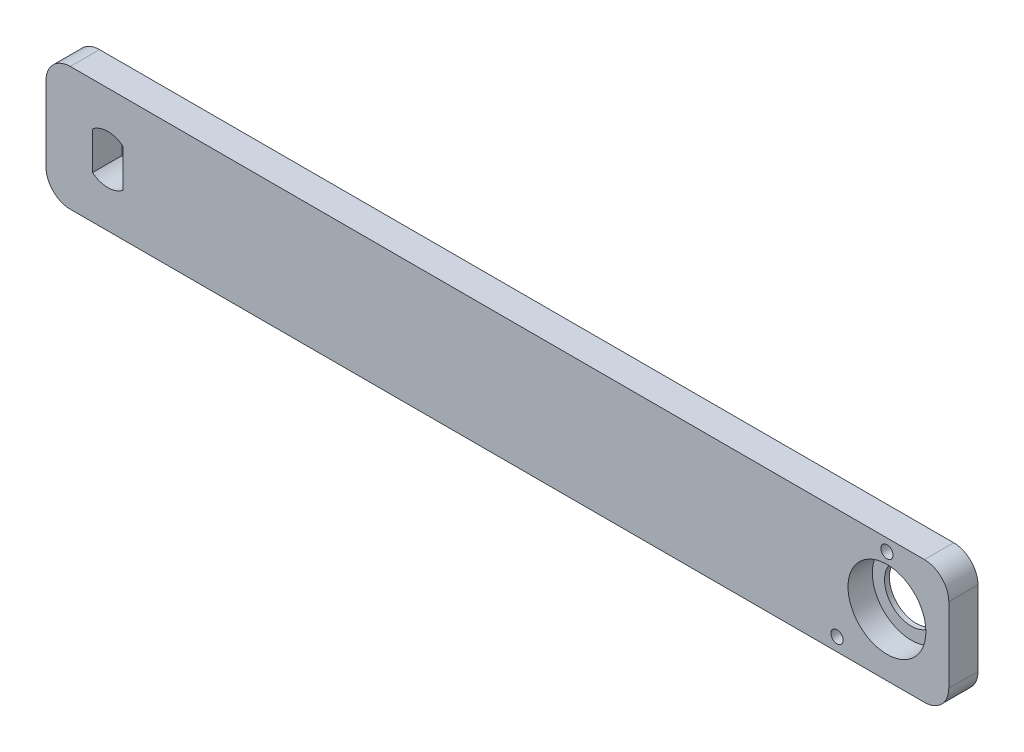
ISO-10303-21;
HEADER;
FILE_DESCRIPTION(('STEP AP214'),'2;1');
FILE_NAME('part.step','',(''),(''),'','','');
FILE_SCHEMA(('AUTOMOTIVE_DESIGN { 1 0 10303 214 1 1 1 1 }'));
ENDSEC;
DATA;
#1=APPLICATION_CONTEXT('core data for automotive mechanical design processes');
#2=APPLICATION_PROTOCOL_DEFINITION('international standard','automotive_design',2000,#1);
#3=PRODUCT_CONTEXT('',#1,'mechanical');
#4=PRODUCT('Part','Part','',(#3));
#5=PRODUCT_RELATED_PRODUCT_CATEGORY('part','',(#4));
#6=PRODUCT_DEFINITION_FORMATION('','',#4);
#7=PRODUCT_DEFINITION_CONTEXT('part definition',#1,'design');
#8=PRODUCT_DEFINITION('design','',#6,#7);
#9=PRODUCT_DEFINITION_SHAPE('','',#8);
#10=(LENGTH_UNIT() NAMED_UNIT(*) SI_UNIT(.MILLI.,.METRE.));
#11=(NAMED_UNIT(*) PLANE_ANGLE_UNIT() SI_UNIT($,.RADIAN.));
#12=(NAMED_UNIT(*) SI_UNIT($,.STERADIAN.) SOLID_ANGLE_UNIT());
#13=UNCERTAINTY_MEASURE_WITH_UNIT(LENGTH_MEASURE(1.E-05),#10,'distance_accuracy_value','');
#14=(GEOMETRIC_REPRESENTATION_CONTEXT(3) GLOBAL_UNCERTAINTY_ASSIGNED_CONTEXT((#13)) GLOBAL_UNIT_ASSIGNED_CONTEXT((#10,
#11,#12)) REPRESENTATION_CONTEXT('',''));
#15=CARTESIAN_POINT('',(0.,0.,0.));
#16=DIRECTION('',(0.,0.,1.));
#17=DIRECTION('',(1.,0.,0.));
#18=AXIS2_PLACEMENT_3D('',#15,#16,#17);
#19=CARTESIAN_POINT('',(320.,0.,12.));
#20=DIRECTION('',(0.,0.,-1.));
#21=DIRECTION('',(-1.,0.,0.));
#22=AXIS2_PLACEMENT_3D('',#19,#20,#21);
#23=CYLINDRICAL_SURFACE('',#22,11.);
#24=CARTESIAN_POINT('',(320.,0.,0.));
#25=DIRECTION('',(0.,0.,1.));
#26=DIRECTION('',(1.,0.,0.));
#27=AXIS2_PLACEMENT_3D('',#24,#25,#26);
#28=CIRCLE('',#27,11.);
#29=CARTESIAN_POINT('',(331.,0.,0.));
#30=VERTEX_POINT('',#29);
#31=EDGE_CURVE('E147',#30,#30,#28,.T.);
#32=ORIENTED_EDGE('',*,*,#31,.F.);
#33=EDGE_LOOP('',(#32));
#34=FACE_BOUND('',#33,.T.);
#35=CARTESIAN_POINT('',(320.,0.,2.));
#36=DIRECTION('',(0.,0.,1.));
#37=DIRECTION('',(1.,0.,0.));
#38=AXIS2_PLACEMENT_3D('',#35,#36,#37);
#39=CIRCLE('',#38,11.);
#40=CARTESIAN_POINT('',(331.,0.,2.));
#41=VERTEX_POINT('',#40);
#42=EDGE_CURVE('E41',#41,#41,#39,.T.);
#43=ORIENTED_EDGE('',*,*,#42,.T.);
#44=EDGE_LOOP('',(#43));
#45=FACE_BOUND('',#44,.T.);
#46=ADVANCED_FACE('F37',(#34,#45),#23,.F.);
#47=CARTESIAN_POINT('',(0.,0.,12.));
#48=DIRECTION('',(0.,0.,1.));
#49=DIRECTION('',(1.,0.,0.));
#50=AXIS2_PLACEMENT_3D('',#47,#48,#49);
#51=PLANE('',#50);
#52=CARTESIAN_POINT('',(299.5,-20.0000000000004,12.));
#53=DIRECTION('',(0.,0.,1.));
#54=DIRECTION('',(1.,0.,0.));
#55=AXIS2_PLACEMENT_3D('',#52,#53,#54);
#56=CIRCLE('',#55,2.50000000000002);
#57=CARTESIAN_POINT('',(302.,-20.0000000000004,12.));
#58=VERTEX_POINT('',#57);
#59=EDGE_CURVE('E434',#58,#58,#56,.T.);
#60=ORIENTED_EDGE('',*,*,#59,.F.);
#61=EDGE_LOOP('',(#60));
#62=FACE_BOUND('',#61,.T.);
#63=CARTESIAN_POINT('',(320.,20.5,12.));
#64=DIRECTION('',(0.,0.,1.));
#65=DIRECTION('',(1.,0.,0.));
#66=AXIS2_PLACEMENT_3D('',#63,#64,#65);
#67=CIRCLE('',#66,2.50000000000002);
#68=CARTESIAN_POINT('',(322.5,20.5,12.));
#69=VERTEX_POINT('',#68);
#70=EDGE_CURVE('E436',#69,#69,#67,.T.);
#71=ORIENTED_EDGE('',*,*,#70,.F.);
#72=EDGE_LOOP('',(#71));
#73=FACE_BOUND('',#72,.T.);
#74=CARTESIAN_POINT('',(320.,0.,12.));
#75=DIRECTION('',(0.,0.,1.));
#76=DIRECTION('',(1.,0.,0.));
#77=AXIS2_PLACEMENT_3D('',#74,#75,#76);
#78=CIRCLE('',#77,16.);
#79=CARTESIAN_POINT('',(336.,0.,12.));
#80=VERTEX_POINT('',#79);
#81=EDGE_CURVE('E442',#80,#80,#78,.T.);
#82=ORIENTED_EDGE('',*,*,#81,.F.);
#83=EDGE_LOOP('',(#82));
#84=FACE_BOUND('',#83,.T.);
#85=DIRECTION('',(1.,0.,0.));
#86=VECTOR('',#85,1.);
#87=CARTESIAN_POINT('',(-25.4,-25.4,12.));
#88=LINE('',#87,#86);
#89=CARTESIAN_POINT('',(-15.4,-25.4,12.));
#90=VERTEX_POINT('',#89);
#91=CARTESIAN_POINT('',(335.4,-25.4,12.));
#92=VERTEX_POINT('',#91);
#93=EDGE_CURVE('E178',#90,#92,#88,.T.);
#94=ORIENTED_EDGE('',*,*,#93,.T.);
#95=CARTESIAN_POINT('',(335.4,-15.4,12.));
#96=DIRECTION('',(0.,0.,1.));
#97=DIRECTION('',(1.,0.,0.));
#98=AXIS2_PLACEMENT_3D('',#95,#96,#97);
#99=CIRCLE('',#98,10.);
#100=CARTESIAN_POINT('',(345.4,-15.4,12.));
#101=VERTEX_POINT('',#100);
#102=EDGE_CURVE('E218',#92,#101,#99,.T.);
#103=ORIENTED_EDGE('',*,*,#102,.T.);
#104=DIRECTION('',(0.,1.,0.));
#105=VECTOR('',#104,1.);
#106=CARTESIAN_POINT('',(345.4,25.4,12.));
#107=LINE('',#106,#105);
#108=CARTESIAN_POINT('',(345.4,15.4,12.));
#109=VERTEX_POINT('',#108);
#110=EDGE_CURVE('E182',#101,#109,#107,.T.);
#111=ORIENTED_EDGE('',*,*,#110,.T.);
#112=CARTESIAN_POINT('',(335.4,15.4,12.));
#113=DIRECTION('',(0.,0.,1.));
#114=DIRECTION('',(1.,0.,0.));
#115=AXIS2_PLACEMENT_3D('',#112,#113,#114);
#116=CIRCLE('',#115,10.);
#117=CARTESIAN_POINT('',(335.4,25.4,12.));
#118=VERTEX_POINT('',#117);
#119=EDGE_CURVE('E60',#109,#118,#116,.T.);
#120=ORIENTED_EDGE('',*,*,#119,.T.);
#121=DIRECTION('',(-1.,0.,0.));
#122=VECTOR('',#121,1.);
#123=CARTESIAN_POINT('',(-25.4,25.4,12.));
#124=LINE('',#123,#122);
#125=CARTESIAN_POINT('',(-15.4,25.4,12.));
#126=VERTEX_POINT('',#125);
#127=EDGE_CURVE('E184',#118,#126,#124,.T.);
#128=ORIENTED_EDGE('',*,*,#127,.T.);
#129=CARTESIAN_POINT('',(-15.4,15.4,12.));
#130=DIRECTION('',(0.,0.,1.));
#131=DIRECTION('',(1.,0.,0.));
#132=AXIS2_PLACEMENT_3D('',#129,#130,#131);
#133=CIRCLE('',#132,10.);
#134=CARTESIAN_POINT('',(-25.4,15.4,12.));
#135=VERTEX_POINT('',#134);
#136=EDGE_CURVE('E213',#126,#135,#133,.T.);
#137=ORIENTED_EDGE('',*,*,#136,.T.);
#138=DIRECTION('',(0.,-1.,0.));
#139=VECTOR('',#138,1.);
#140=CARTESIAN_POINT('',(-25.4,25.4,12.));
#141=LINE('',#140,#139);
#142=CARTESIAN_POINT('',(-25.4,-15.4,12.));
#143=VERTEX_POINT('',#142);
#144=EDGE_CURVE('E175',#135,#143,#141,.T.);
#145=ORIENTED_EDGE('',*,*,#144,.T.);
#146=CARTESIAN_POINT('',(-15.4,-15.4,12.));
#147=DIRECTION('',(0.,0.,1.));
#148=DIRECTION('',(1.,0.,0.));
#149=AXIS2_PLACEMENT_3D('',#146,#147,#148);
#150=CIRCLE('',#149,10.);
#151=EDGE_CURVE('E215',#143,#90,#150,.T.);
#152=ORIENTED_EDGE('',*,*,#151,.T.);
#153=EDGE_LOOP('',(#94,#103,#111,#120,#128,#137,#145,#152));
#154=FACE_BOUND('',#153,.T.);
#155=DIRECTION('',(0.,-1.,0.));
#156=VECTOR('',#155,1.);
#157=CARTESIAN_POINT('',(-6.28,-7.7821333835909,12.));
#158=LINE('',#157,#156);
#159=CARTESIAN_POINT('',(-6.28,7.7821333835909,12.));
#160=VERTEX_POINT('',#159);
#161=CARTESIAN_POINT('',(-6.28000000000001,-7.7821333835909,12.));
#162=VERTEX_POINT('',#161);
#163=EDGE_CURVE('E139',#160,#162,#158,.T.);
#164=ORIENTED_EDGE('',*,*,#163,.F.);
#165=CARTESIAN_POINT('',(0.,0.,12.));
#166=DIRECTION('',(0.,0.,1.));
#167=DIRECTION('',(1.,0.,0.));
#168=AXIS2_PLACEMENT_3D('',#165,#166,#167);
#169=CIRCLE('',#168,10.);
#170=CARTESIAN_POINT('',(6.28,7.7821333835909,12.));
#171=VERTEX_POINT('',#170);
#172=EDGE_CURVE('E129',#171,#160,#169,.T.);
#173=ORIENTED_EDGE('',*,*,#172,.F.);
#174=DIRECTION('',(0.,1.,0.));
#175=VECTOR('',#174,1.);
#176=CARTESIAN_POINT('',(6.28,-7.7821333835909,12.));
#177=LINE('',#176,#175);
#178=CARTESIAN_POINT('',(6.28,-7.7821333835909,12.));
#179=VERTEX_POINT('',#178);
#180=EDGE_CURVE('E155',#179,#171,#177,.T.);
#181=ORIENTED_EDGE('',*,*,#180,.F.);
#182=CARTESIAN_POINT('',(0.,0.,12.));
#183=DIRECTION('',(0.,0.,1.));
#184=DIRECTION('',(1.,0.,0.));
#185=AXIS2_PLACEMENT_3D('',#182,#183,#184);
#186=CIRCLE('',#185,10.);
#187=EDGE_CURVE('E153',#162,#179,#186,.T.);
#188=ORIENTED_EDGE('',*,*,#187,.F.);
#189=EDGE_LOOP('',(#164,#173,#181,#188));
#190=FACE_BOUND('',#189,.T.);
#191=ADVANCED_FACE('F151',(#62,#73,#84,#154,#190),#51,.T.);
#192=CARTESIAN_POINT('',(0.,0.,0.));
#193=DIRECTION('',(0.,0.,1.));
#194=DIRECTION('',(1.,0.,0.));
#195=AXIS2_PLACEMENT_3D('',#192,#193,#194);
#196=PLANE('',#195);
#197=CARTESIAN_POINT('',(299.5,-20.0000000000004,0.));
#198=DIRECTION('',(0.,0.,1.));
#199=DIRECTION('',(1.,0.,0.));
#200=AXIS2_PLACEMENT_3D('',#197,#198,#199);
#201=CIRCLE('',#200,2.50000000000002);
#202=CARTESIAN_POINT('',(302.,-20.0000000000004,0.));
#203=VERTEX_POINT('',#202);
#204=EDGE_CURVE('E431',#203,#203,#201,.T.);
#205=ORIENTED_EDGE('',*,*,#204,.T.);
#206=EDGE_LOOP('',(#205));
#207=FACE_BOUND('',#206,.T.);
#208=CARTESIAN_POINT('',(320.,20.5,0.));
#209=DIRECTION('',(0.,0.,1.));
#210=DIRECTION('',(1.,0.,0.));
#211=AXIS2_PLACEMENT_3D('',#208,#209,#210);
#212=CIRCLE('',#211,2.50000000000002);
#213=CARTESIAN_POINT('',(322.5,20.5,0.));
#214=VERTEX_POINT('',#213);
#215=EDGE_CURVE('E439',#214,#214,#212,.T.);
#216=ORIENTED_EDGE('',*,*,#215,.T.);
#217=EDGE_LOOP('',(#216));
#218=FACE_BOUND('',#217,.T.);
#219=ORIENTED_EDGE('',*,*,#31,.T.);
#220=EDGE_LOOP('',(#219));
#221=FACE_BOUND('',#220,.T.);
#222=DIRECTION('',(0.,1.,0.));
#223=VECTOR('',#222,1.);
#224=CARTESIAN_POINT('',(345.4,25.4,0.));
#225=LINE('',#224,#223);
#226=CARTESIAN_POINT('',(345.4,-15.4,0.));
#227=VERTEX_POINT('',#226);
#228=CARTESIAN_POINT('',(345.4,15.4,0.));
#229=VERTEX_POINT('',#228);
#230=EDGE_CURVE('E192',#227,#229,#225,.T.);
#231=ORIENTED_EDGE('',*,*,#230,.F.);
#232=CARTESIAN_POINT('',(335.4,-15.4,0.));
#233=DIRECTION('',(0.,0.,1.));
#234=DIRECTION('',(1.,0.,0.));
#235=AXIS2_PLACEMENT_3D('',#232,#233,#234);
#236=CIRCLE('',#235,10.);
#237=CARTESIAN_POINT('',(335.4,-25.4,0.));
#238=VERTEX_POINT('',#237);
#239=EDGE_CURVE('E206',#227,#238,#236,.F.);
#240=ORIENTED_EDGE('',*,*,#239,.T.);
#241=DIRECTION('',(1.,0.,0.));
#242=VECTOR('',#241,1.);
#243=CARTESIAN_POINT('',(-25.4,-25.4,0.));
#244=LINE('',#243,#242);
#245=CARTESIAN_POINT('',(-15.4,-25.4,0.));
#246=VERTEX_POINT('',#245);
#247=EDGE_CURVE('E189',#246,#238,#244,.T.);
#248=ORIENTED_EDGE('',*,*,#247,.F.);
#249=CARTESIAN_POINT('',(-15.4,-15.4,0.));
#250=DIRECTION('',(0.,0.,1.));
#251=DIRECTION('',(1.,0.,0.));
#252=AXIS2_PLACEMENT_3D('',#249,#250,#251);
#253=CIRCLE('',#252,10.);
#254=CARTESIAN_POINT('',(-25.4,-15.4,0.));
#255=VERTEX_POINT('',#254);
#256=EDGE_CURVE('E202',#246,#255,#253,.F.);
#257=ORIENTED_EDGE('',*,*,#256,.T.);
#258=DIRECTION('',(0.,-1.,0.));
#259=VECTOR('',#258,1.);
#260=CARTESIAN_POINT('',(-25.4,25.4,0.));
#261=LINE('',#260,#259);
#262=CARTESIAN_POINT('',(-25.4,15.4,0.));
#263=VERTEX_POINT('',#262);
#264=EDGE_CURVE('E174',#263,#255,#261,.T.);
#265=ORIENTED_EDGE('',*,*,#264,.F.);
#266=CARTESIAN_POINT('',(-15.4,15.4,0.));
#267=DIRECTION('',(0.,0.,1.));
#268=DIRECTION('',(1.,0.,0.));
#269=AXIS2_PLACEMENT_3D('',#266,#267,#268);
#270=CIRCLE('',#269,10.);
#271=CARTESIAN_POINT('',(-15.4,25.4,0.));
#272=VERTEX_POINT('',#271);
#273=EDGE_CURVE('E200',#263,#272,#270,.F.);
#274=ORIENTED_EDGE('',*,*,#273,.T.);
#275=DIRECTION('',(-1.,0.,0.));
#276=VECTOR('',#275,1.);
#277=CARTESIAN_POINT('',(-25.4,25.4,0.));
#278=LINE('',#277,#276);
#279=CARTESIAN_POINT('',(335.4,25.4,0.));
#280=VERTEX_POINT('',#279);
#281=EDGE_CURVE('E179',#280,#272,#278,.T.);
#282=ORIENTED_EDGE('',*,*,#281,.F.);
#283=CARTESIAN_POINT('',(335.4,15.4,0.));
#284=DIRECTION('',(0.,0.,1.));
#285=DIRECTION('',(1.,0.,0.));
#286=AXIS2_PLACEMENT_3D('',#283,#284,#285);
#287=CIRCLE('',#286,10.);
#288=EDGE_CURVE('E204',#280,#229,#287,.F.);
#289=ORIENTED_EDGE('',*,*,#288,.T.);
#290=EDGE_LOOP('',(#231,#240,#248,#257,#265,#274,#282,#289));
#291=FACE_BOUND('',#290,.T.);
#292=CARTESIAN_POINT('',(0.,0.,0.));
#293=DIRECTION('',(0.,0.,1.));
#294=DIRECTION('',(1.,0.,0.));
#295=AXIS2_PLACEMENT_3D('',#292,#293,#294);
#296=CIRCLE('',#295,10.);
#297=CARTESIAN_POINT('',(6.28,7.7821333835909,0.));
#298=VERTEX_POINT('',#297);
#299=CARTESIAN_POINT('',(-6.28,7.7821333835909,0.));
#300=VERTEX_POINT('',#299);
#301=EDGE_CURVE('E160',#298,#300,#296,.T.);
#302=ORIENTED_EDGE('',*,*,#301,.T.);
#303=DIRECTION('',(0.,-1.,0.));
#304=VECTOR('',#303,1.);
#305=CARTESIAN_POINT('',(-6.28,-7.7821333835909,0.));
#306=LINE('',#305,#304);
#307=CARTESIAN_POINT('',(-6.28000000000001,-7.7821333835909,0.));
#308=VERTEX_POINT('',#307);
#309=EDGE_CURVE('E146',#300,#308,#306,.T.);
#310=ORIENTED_EDGE('',*,*,#309,.T.);
#311=CARTESIAN_POINT('',(0.,0.,0.));
#312=DIRECTION('',(0.,0.,1.));
#313=DIRECTION('',(1.,0.,0.));
#314=AXIS2_PLACEMENT_3D('',#311,#312,#313);
#315=CIRCLE('',#314,10.);
#316=CARTESIAN_POINT('',(6.28,-7.7821333835909,0.));
#317=VERTEX_POINT('',#316);
#318=EDGE_CURVE('E163',#308,#317,#315,.T.);
#319=ORIENTED_EDGE('',*,*,#318,.T.);
#320=DIRECTION('',(0.,1.,0.));
#321=VECTOR('',#320,1.);
#322=CARTESIAN_POINT('',(6.28,-7.7821333835909,0.));
#323=LINE('',#322,#321);
#324=EDGE_CURVE('E140',#317,#298,#323,.T.);
#325=ORIENTED_EDGE('',*,*,#324,.T.);
#326=EDGE_LOOP('',(#302,#310,#319,#325));
#327=FACE_BOUND('',#326,.T.);
#328=ADVANCED_FACE('F235',(#207,#218,#221,#291,#327),#196,.F.);
#329=CARTESIAN_POINT('',(-25.4,25.4,12.));
#330=DIRECTION('',(1.,0.,0.));
#331=DIRECTION('',(0.,1.,0.));
#332=AXIS2_PLACEMENT_3D('',#329,#330,#331);
#333=PLANE('',#332);
#334=ORIENTED_EDGE('',*,*,#264,.T.);
#335=DIRECTION('',(0.,0.,-1.));
#336=VECTOR('',#335,1.);
#337=CARTESIAN_POINT('',(-25.4,-15.4,12.));
#338=LINE('',#337,#336);
#339=EDGE_CURVE('E11',#255,#143,#338,.F.);
#340=ORIENTED_EDGE('',*,*,#339,.T.);
#341=ORIENTED_EDGE('',*,*,#144,.F.);
#342=DIRECTION('',(0.,0.,-1.));
#343=VECTOR('',#342,1.);
#344=CARTESIAN_POINT('',(-25.4,15.4,12.));
#345=LINE('',#344,#343);
#346=EDGE_CURVE('E46',#135,#263,#345,.T.);
#347=ORIENTED_EDGE('',*,*,#346,.T.);
#348=EDGE_LOOP('',(#334,#340,#341,#347));
#349=FACE_BOUND('',#348,.T.);
#350=ADVANCED_FACE('F229',(#349),#333,.F.);
#351=CARTESIAN_POINT('',(-25.4,-25.4,12.));
#352=DIRECTION('',(0.,1.,0.));
#353=DIRECTION('',(0.,0.,1.));
#354=AXIS2_PLACEMENT_3D('',#351,#352,#353);
#355=PLANE('',#354);
#356=ORIENTED_EDGE('',*,*,#247,.T.);
#357=DIRECTION('',(0.,0.,-1.));
#358=VECTOR('',#357,1.);
#359=CARTESIAN_POINT('',(335.4,-25.4,12.));
#360=LINE('',#359,#358);
#361=EDGE_CURVE('E211',#238,#92,#360,.F.);
#362=ORIENTED_EDGE('',*,*,#361,.T.);
#363=ORIENTED_EDGE('',*,*,#93,.F.);
#364=DIRECTION('',(0.,0.,-1.));
#365=VECTOR('',#364,1.);
#366=CARTESIAN_POINT('',(-15.4,-25.4,12.));
#367=LINE('',#366,#365);
#368=EDGE_CURVE('E208',#90,#246,#367,.T.);
#369=ORIENTED_EDGE('',*,*,#368,.T.);
#370=EDGE_LOOP('',(#356,#362,#363,#369));
#371=FACE_BOUND('',#370,.T.);
#372=ADVANCED_FACE('F245',(#371),#355,.F.);
#373=CARTESIAN_POINT('',(345.4,25.4,12.));
#374=DIRECTION('',(-1.,0.,0.));
#375=DIRECTION('',(0.,0.,1.));
#376=AXIS2_PLACEMENT_3D('',#373,#374,#375);
#377=PLANE('',#376);
#378=ORIENTED_EDGE('',*,*,#110,.F.);
#379=DIRECTION('',(0.,0.,-1.));
#380=VECTOR('',#379,1.);
#381=CARTESIAN_POINT('',(345.4,-15.4,12.));
#382=LINE('',#381,#380);
#383=EDGE_CURVE('E197',#101,#227,#382,.T.);
#384=ORIENTED_EDGE('',*,*,#383,.T.);
#385=ORIENTED_EDGE('',*,*,#230,.T.);
#386=DIRECTION('',(0.,0.,-1.));
#387=VECTOR('',#386,1.);
#388=CARTESIAN_POINT('',(345.4,15.4,12.));
#389=LINE('',#388,#387);
#390=EDGE_CURVE('E186',#229,#109,#389,.F.);
#391=ORIENTED_EDGE('',*,*,#390,.T.);
#392=EDGE_LOOP('',(#378,#384,#385,#391));
#393=FACE_BOUND('',#392,.T.);
#394=ADVANCED_FACE('F253',(#393),#377,.F.);
#395=CARTESIAN_POINT('',(-25.4,25.4,12.));
#396=DIRECTION('',(0.,-1.,0.));
#397=DIRECTION('',(0.,0.,-1.));
#398=AXIS2_PLACEMENT_3D('',#395,#396,#397);
#399=PLANE('',#398);
#400=ORIENTED_EDGE('',*,*,#127,.F.);
#401=DIRECTION('',(0.,0.,-1.));
#402=VECTOR('',#401,1.);
#403=CARTESIAN_POINT('',(335.4,25.4,12.));
#404=LINE('',#403,#402);
#405=EDGE_CURVE('E221',#118,#280,#404,.T.);
#406=ORIENTED_EDGE('',*,*,#405,.T.);
#407=ORIENTED_EDGE('',*,*,#281,.T.);
#408=DIRECTION('',(0.,0.,-1.));
#409=VECTOR('',#408,1.);
#410=CARTESIAN_POINT('',(-15.4,25.4,12.));
#411=LINE('',#410,#409);
#412=EDGE_CURVE('E53',#272,#126,#411,.F.);
#413=ORIENTED_EDGE('',*,*,#412,.T.);
#414=EDGE_LOOP('',(#400,#406,#407,#413));
#415=FACE_BOUND('',#414,.T.);
#416=ADVANCED_FACE('F258',(#415),#399,.F.);
#417=CARTESIAN_POINT('',(0.,0.,12.));
#418=DIRECTION('',(0.,0.,-1.));
#419=DIRECTION('',(-1.,0.,0.));
#420=AXIS2_PLACEMENT_3D('',#417,#418,#419);
#421=CYLINDRICAL_SURFACE('',#420,10.);
#422=ORIENTED_EDGE('',*,*,#301,.F.);
#423=DIRECTION('',(0.,0.,-1.));
#424=VECTOR('',#423,1.);
#425=CARTESIAN_POINT('',(6.28,7.7821333835909,12.));
#426=LINE('',#425,#424);
#427=EDGE_CURVE('E135',#171,#298,#426,.T.);
#428=ORIENTED_EDGE('',*,*,#427,.F.);
#429=ORIENTED_EDGE('',*,*,#172,.T.);
#430=DIRECTION('',(0.,0.,-1.));
#431=VECTOR('',#430,1.);
#432=CARTESIAN_POINT('',(-6.28,7.7821333835909,12.));
#433=LINE('',#432,#431);
#434=EDGE_CURVE('E132',#160,#300,#433,.T.);
#435=ORIENTED_EDGE('',*,*,#434,.T.);
#436=EDGE_LOOP('',(#422,#428,#429,#435));
#437=FACE_BOUND('',#436,.T.);
#438=ADVANCED_FACE('F131',(#437),#421,.F.);
#439=CARTESIAN_POINT('',(-6.28,-7.7821333835909,12.));
#440=DIRECTION('',(1.,0.,0.));
#441=DIRECTION('',(0.,0.,-1.));
#442=AXIS2_PLACEMENT_3D('',#439,#440,#441);
#443=PLANE('',#442);
#444=ORIENTED_EDGE('',*,*,#309,.F.);
#445=ORIENTED_EDGE('',*,*,#434,.F.);
#446=ORIENTED_EDGE('',*,*,#163,.T.);
#447=DIRECTION('',(0.,0.,-1.));
#448=VECTOR('',#447,1.);
#449=CARTESIAN_POINT('',(-6.28000000000001,-7.7821333835909,12.));
#450=LINE('',#449,#448);
#451=EDGE_CURVE('E148',#162,#308,#450,.T.);
#452=ORIENTED_EDGE('',*,*,#451,.T.);
#453=EDGE_LOOP('',(#444,#445,#446,#452));
#454=FACE_BOUND('',#453,.T.);
#455=ADVANCED_FACE('F143',(#454),#443,.T.);
#456=CARTESIAN_POINT('',(0.,0.,12.));
#457=DIRECTION('',(0.,0.,-1.));
#458=DIRECTION('',(-1.,0.,0.));
#459=AXIS2_PLACEMENT_3D('',#456,#457,#458);
#460=CYLINDRICAL_SURFACE('',#459,10.);
#461=ORIENTED_EDGE('',*,*,#318,.F.);
#462=ORIENTED_EDGE('',*,*,#451,.F.);
#463=ORIENTED_EDGE('',*,*,#187,.T.);
#464=DIRECTION('',(0.,0.,-1.));
#465=VECTOR('',#464,1.);
#466=CARTESIAN_POINT('',(6.28,-7.7821333835909,12.));
#467=LINE('',#466,#465);
#468=EDGE_CURVE('E169',#179,#317,#467,.T.);
#469=ORIENTED_EDGE('',*,*,#468,.T.);
#470=EDGE_LOOP('',(#461,#462,#463,#469));
#471=FACE_BOUND('',#470,.T.);
#472=ADVANCED_FACE('F369',(#471),#460,.F.);
#473=CARTESIAN_POINT('',(6.28,-7.7821333835909,12.));
#474=DIRECTION('',(-1.,0.,0.));
#475=DIRECTION('',(0.,0.,1.));
#476=AXIS2_PLACEMENT_3D('',#473,#474,#475);
#477=PLANE('',#476);
#478=ORIENTED_EDGE('',*,*,#324,.F.);
#479=ORIENTED_EDGE('',*,*,#468,.F.);
#480=ORIENTED_EDGE('',*,*,#180,.T.);
#481=ORIENTED_EDGE('',*,*,#427,.T.);
#482=EDGE_LOOP('',(#478,#479,#480,#481));
#483=FACE_BOUND('',#482,.T.);
#484=ADVANCED_FACE('F294',(#483),#477,.T.);
#485=CARTESIAN_POINT('',(335.4,-15.4,12.));
#486=DIRECTION('',(0.,0.,-1.));
#487=DIRECTION('',(-1.,0.,0.));
#488=AXIS2_PLACEMENT_3D('',#485,#486,#487);
#489=CYLINDRICAL_SURFACE('',#488,10.);
#490=ORIENTED_EDGE('',*,*,#102,.F.);
#491=ORIENTED_EDGE('',*,*,#361,.F.);
#492=ORIENTED_EDGE('',*,*,#239,.F.);
#493=ORIENTED_EDGE('',*,*,#383,.F.);
#494=EDGE_LOOP('',(#490,#491,#492,#493));
#495=FACE_BOUND('',#494,.T.);
#496=ADVANCED_FACE('F251',(#495),#489,.T.);
#497=CARTESIAN_POINT('',(335.4,15.4,12.));
#498=DIRECTION('',(0.,0.,-1.));
#499=DIRECTION('',(-1.,0.,0.));
#500=AXIS2_PLACEMENT_3D('',#497,#498,#499);
#501=CYLINDRICAL_SURFACE('',#500,10.);
#502=ORIENTED_EDGE('',*,*,#119,.F.);
#503=ORIENTED_EDGE('',*,*,#390,.F.);
#504=ORIENTED_EDGE('',*,*,#288,.F.);
#505=ORIENTED_EDGE('',*,*,#405,.F.);
#506=EDGE_LOOP('',(#502,#503,#504,#505));
#507=FACE_BOUND('',#506,.T.);
#508=ADVANCED_FACE('F257',(#507),#501,.T.);
#509=CARTESIAN_POINT('',(-15.4,-15.4,12.));
#510=DIRECTION('',(0.,0.,-1.));
#511=DIRECTION('',(-1.,0.,0.));
#512=AXIS2_PLACEMENT_3D('',#509,#510,#511);
#513=CYLINDRICAL_SURFACE('',#512,10.);
#514=ORIENTED_EDGE('',*,*,#151,.F.);
#515=ORIENTED_EDGE('',*,*,#339,.F.);
#516=ORIENTED_EDGE('',*,*,#256,.F.);
#517=ORIENTED_EDGE('',*,*,#368,.F.);
#518=EDGE_LOOP('',(#514,#515,#516,#517));
#519=FACE_BOUND('',#518,.T.);
#520=ADVANCED_FACE('F242',(#519),#513,.T.);
#521=CARTESIAN_POINT('',(-15.4,15.4,12.));
#522=DIRECTION('',(0.,0.,-1.));
#523=DIRECTION('',(-1.,0.,0.));
#524=AXIS2_PLACEMENT_3D('',#521,#522,#523);
#525=CYLINDRICAL_SURFACE('',#524,10.);
#526=ORIENTED_EDGE('',*,*,#136,.F.);
#527=ORIENTED_EDGE('',*,*,#412,.F.);
#528=ORIENTED_EDGE('',*,*,#273,.F.);
#529=ORIENTED_EDGE('',*,*,#346,.F.);
#530=EDGE_LOOP('',(#526,#527,#528,#529));
#531=FACE_BOUND('',#530,.T.);
#532=ADVANCED_FACE('F39',(#531),#525,.T.);
#533=CARTESIAN_POINT('',(320.,0.,2.));
#534=DIRECTION('',(0.,0.,1.));
#535=DIRECTION('',(1.,0.,0.));
#536=AXIS2_PLACEMENT_3D('',#533,#534,#535);
#537=CYLINDRICAL_SURFACE('',#536,16.);
#538=CARTESIAN_POINT('',(320.,0.,2.));
#539=DIRECTION('',(0.,0.,1.));
#540=DIRECTION('',(1.,0.,0.));
#541=AXIS2_PLACEMENT_3D('',#538,#539,#540);
#542=CIRCLE('',#541,16.);
#543=CARTESIAN_POINT('',(336.,0.,2.));
#544=VERTEX_POINT('',#543);
#545=EDGE_CURVE('E445',#544,#544,#542,.T.);
#546=ORIENTED_EDGE('',*,*,#545,.F.);
#547=EDGE_LOOP('',(#546));
#548=FACE_BOUND('',#547,.T.);
#549=ORIENTED_EDGE('',*,*,#81,.T.);
#550=EDGE_LOOP('',(#549));
#551=FACE_BOUND('',#550,.T.);
#552=ADVANCED_FACE('F260',(#548,#551),#537,.F.);
#553=CARTESIAN_POINT('',(320.,0.,2.));
#554=DIRECTION('',(0.,0.,1.));
#555=DIRECTION('',(1.,0.,0.));
#556=AXIS2_PLACEMENT_3D('',#553,#554,#555);
#557=PLANE('',#556);
#558=ORIENTED_EDGE('',*,*,#42,.F.);
#559=EDGE_LOOP('',(#558));
#560=FACE_BOUND('',#559,.T.);
#561=ORIENTED_EDGE('',*,*,#545,.T.);
#562=EDGE_LOOP('',(#561));
#563=FACE_BOUND('',#562,.T.);
#564=ADVANCED_FACE('F265',(#560,#563),#557,.T.);
#565=CARTESIAN_POINT('',(320.,20.5,0.));
#566=DIRECTION('',(0.,0.,1.));
#567=DIRECTION('',(1.,0.,0.));
#568=AXIS2_PLACEMENT_3D('',#565,#566,#567);
#569=CYLINDRICAL_SURFACE('',#568,2.50000000000002);
#570=ORIENTED_EDGE('',*,*,#215,.F.);
#571=EDGE_LOOP('',(#570));
#572=FACE_BOUND('',#571,.T.);
#573=ORIENTED_EDGE('',*,*,#70,.T.);
#574=EDGE_LOOP('',(#573));
#575=FACE_BOUND('',#574,.T.);
#576=ADVANCED_FACE('F328',(#572,#575),#569,.F.);
#577=CARTESIAN_POINT('',(299.5,-20.0000000000004,0.));
#578=DIRECTION('',(0.,0.,1.));
#579=DIRECTION('',(1.,0.,0.));
#580=AXIS2_PLACEMENT_3D('',#577,#578,#579);
#581=CYLINDRICAL_SURFACE('',#580,2.50000000000002);
#582=ORIENTED_EDGE('',*,*,#204,.F.);
#583=EDGE_LOOP('',(#582));
#584=FACE_BOUND('',#583,.T.);
#585=ORIENTED_EDGE('',*,*,#59,.T.);
#586=EDGE_LOOP('',(#585));
#587=FACE_BOUND('',#586,.T.);
#588=ADVANCED_FACE('F351',(#584,#587),#581,.F.);
#589=CLOSED_SHELL('',(#46,#191,#328,#350,#372,#394,#416,#438,#455,#472,#484,#496,#508,#520,#532,
#552,#564,#576,#588));
#590=MANIFOLD_SOLID_BREP('B2',#589);
#591=ADVANCED_BREP_SHAPE_REPRESENTATION('',(#18,#590),#14);
#592=SHAPE_DEFINITION_REPRESENTATION(#9,#591);
ENDSEC;
END-ISO-10303-21;
